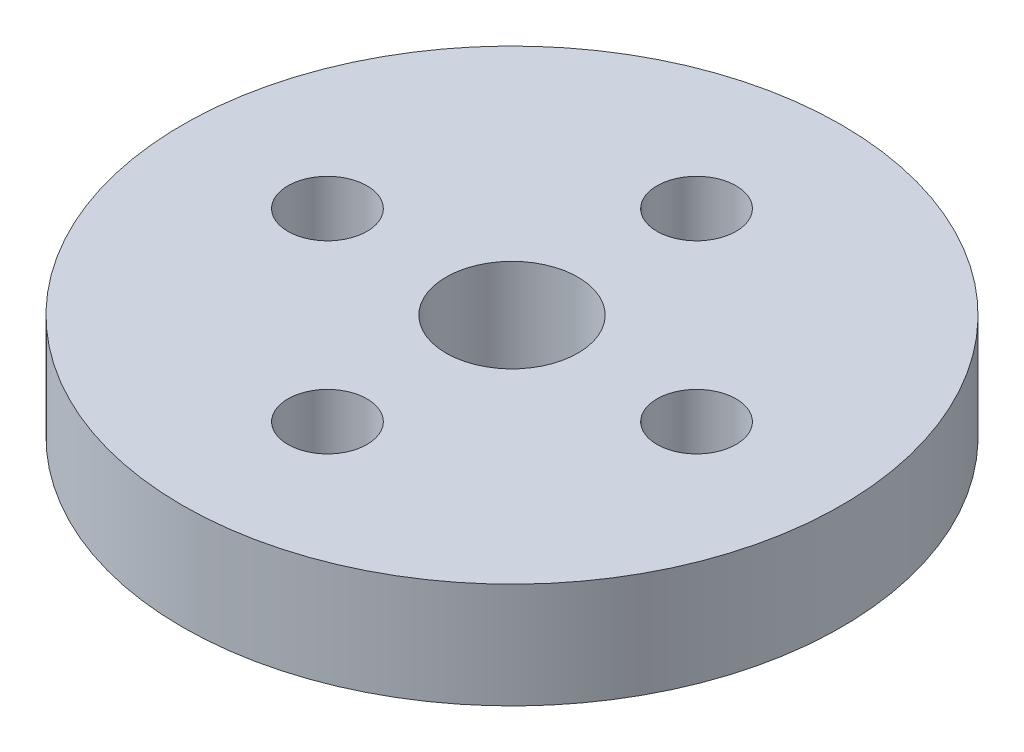
ISO-10303-21;
HEADER;
FILE_DESCRIPTION(('STEP AP214'),'2;1');
FILE_NAME('part.step','',(''),(''),'','','');
FILE_SCHEMA(('AUTOMOTIVE_DESIGN { 1 0 10303 214 1 1 1 1 }'));
ENDSEC;
DATA;
#1=APPLICATION_CONTEXT('core data for automotive mechanical design processes');
#2=APPLICATION_PROTOCOL_DEFINITION('international standard','automotive_design',2000,#1);
#3=PRODUCT_CONTEXT('',#1,'mechanical');
#4=PRODUCT('Part','Part','',(#3));
#5=PRODUCT_RELATED_PRODUCT_CATEGORY('part','',(#4));
#6=PRODUCT_DEFINITION_FORMATION('','',#4);
#7=PRODUCT_DEFINITION_CONTEXT('part definition',#1,'design');
#8=PRODUCT_DEFINITION('design','',#6,#7);
#9=PRODUCT_DEFINITION_SHAPE('','',#8);
#10=(LENGTH_UNIT() NAMED_UNIT(*) SI_UNIT(.MILLI.,.METRE.));
#11=(NAMED_UNIT(*) PLANE_ANGLE_UNIT() SI_UNIT($,.RADIAN.));
#12=(NAMED_UNIT(*) SI_UNIT($,.STERADIAN.) SOLID_ANGLE_UNIT());
#13=UNCERTAINTY_MEASURE_WITH_UNIT(LENGTH_MEASURE(1.E-05),#10,'distance_accuracy_value','');
#14=(GEOMETRIC_REPRESENTATION_CONTEXT(3) GLOBAL_UNCERTAINTY_ASSIGNED_CONTEXT((#13)) GLOBAL_UNIT_ASSIGNED_CONTEXT((#10,
#11,#12)) REPRESENTATION_CONTEXT('',''));
#15=CARTESIAN_POINT('',(0.,0.,0.));
#16=DIRECTION('',(0.,0.,1.));
#17=DIRECTION('',(1.,0.,0.));
#18=AXIS2_PLACEMENT_3D('',#15,#16,#17);
#19=CARTESIAN_POINT('',(0.,4.,0.));
#20=DIRECTION('',(0.,1.,0.));
#21=DIRECTION('',(0.,0.,1.));
#22=AXIS2_PLACEMENT_3D('',#19,#20,#21);
#23=PLANE('',#22);
#24=CARTESIAN_POINT('',(-7.,4.,0.));
#25=DIRECTION('',(0.,1.,0.));
#26=DIRECTION('',(0.,0.,1.));
#27=AXIS2_PLACEMENT_3D('',#24,#25,#26);
#28=CIRCLE('',#27,1.5);
#29=CARTESIAN_POINT('',(-7.,4.,1.5));
#30=VERTEX_POINT('',#29);
#31=EDGE_CURVE('E67',#30,#30,#28,.T.);
#32=ORIENTED_EDGE('',*,*,#31,.F.);
#33=EDGE_LOOP('',(#32));
#34=FACE_BOUND('',#33,.T.);
#35=CARTESIAN_POINT('',(7.,4.,0.));
#36=DIRECTION('',(0.,1.,0.));
#37=DIRECTION('',(0.,0.,1.));
#38=AXIS2_PLACEMENT_3D('',#35,#36,#37);
#39=CIRCLE('',#38,1.5);
#40=CARTESIAN_POINT('',(7.,4.,1.5));
#41=VERTEX_POINT('',#40);
#42=EDGE_CURVE('E55',#41,#41,#39,.T.);
#43=ORIENTED_EDGE('',*,*,#42,.F.);
#44=EDGE_LOOP('',(#43));
#45=FACE_BOUND('',#44,.T.);
#46=CARTESIAN_POINT('',(0.,4.,0.));
#47=DIRECTION('',(0.,1.,0.));
#48=DIRECTION('',(0.,0.,1.));
#49=AXIS2_PLACEMENT_3D('',#46,#47,#48);
#50=CIRCLE('',#49,12.5);
#51=CARTESIAN_POINT('',(0.,4.,12.5));
#52=VERTEX_POINT('',#51);
#53=EDGE_CURVE('E10',#52,#52,#50,.T.);
#54=ORIENTED_EDGE('',*,*,#53,.T.);
#55=EDGE_LOOP('',(#54));
#56=FACE_BOUND('',#55,.T.);
#57=CARTESIAN_POINT('',(0.,4.,-7.));
#58=DIRECTION('',(0.,1.,0.));
#59=DIRECTION('',(0.,0.,1.));
#60=AXIS2_PLACEMENT_3D('',#57,#58,#59);
#61=CIRCLE('',#60,1.5);
#62=CARTESIAN_POINT('',(0.,4.,-5.5));
#63=VERTEX_POINT('',#62);
#64=EDGE_CURVE('E50',#63,#63,#61,.T.);
#65=ORIENTED_EDGE('',*,*,#64,.F.);
#66=EDGE_LOOP('',(#65));
#67=FACE_BOUND('',#66,.T.);
#68=CARTESIAN_POINT('',(0.,4.,7.));
#69=DIRECTION('',(0.,1.,0.));
#70=DIRECTION('',(0.,0.,1.));
#71=AXIS2_PLACEMENT_3D('',#68,#69,#70);
#72=CIRCLE('',#71,1.5);
#73=CARTESIAN_POINT('',(0.,4.,8.5));
#74=VERTEX_POINT('',#73);
#75=EDGE_CURVE('E61',#74,#74,#72,.T.);
#76=ORIENTED_EDGE('',*,*,#75,.F.);
#77=EDGE_LOOP('',(#76));
#78=FACE_BOUND('',#77,.T.);
#79=CARTESIAN_POINT('',(0.,4.,0.));
#80=DIRECTION('',(0.,1.,0.));
#81=DIRECTION('',(0.,0.,1.));
#82=AXIS2_PLACEMENT_3D('',#79,#80,#81);
#83=CIRCLE('',#82,2.5);
#84=CARTESIAN_POINT('',(0.,4.,2.5));
#85=VERTEX_POINT('',#84);
#86=EDGE_CURVE('E73',#85,#85,#83,.T.);
#87=ORIENTED_EDGE('',*,*,#86,.F.);
#88=EDGE_LOOP('',(#87));
#89=FACE_BOUND('',#88,.T.);
#90=ADVANCED_FACE('F39',(#34,#45,#56,#67,#78,#89),#23,.T.);
#91=CARTESIAN_POINT('',(0.,0.,0.));
#92=DIRECTION('',(0.,1.,0.));
#93=DIRECTION('',(0.,0.,1.));
#94=AXIS2_PLACEMENT_3D('',#91,#92,#93);
#95=PLANE('',#94);
#96=CARTESIAN_POINT('',(0.,0.,0.));
#97=DIRECTION('',(0.,1.,0.));
#98=DIRECTION('',(0.,0.,1.));
#99=AXIS2_PLACEMENT_3D('',#96,#97,#98);
#100=CIRCLE('',#99,12.5);
#101=CARTESIAN_POINT('',(0.,0.,12.5));
#102=VERTEX_POINT('',#101);
#103=EDGE_CURVE('E43',#102,#102,#100,.T.);
#104=ORIENTED_EDGE('',*,*,#103,.F.);
#105=EDGE_LOOP('',(#104));
#106=FACE_BOUND('',#105,.T.);
#107=CARTESIAN_POINT('',(0.,0.,-7.));
#108=DIRECTION('',(0.,1.,0.));
#109=DIRECTION('',(0.,0.,1.));
#110=AXIS2_PLACEMENT_3D('',#107,#108,#109);
#111=CIRCLE('',#110,1.5);
#112=CARTESIAN_POINT('',(0.,0.,-5.5));
#113=VERTEX_POINT('',#112);
#114=EDGE_CURVE('E52',#113,#113,#111,.T.);
#115=ORIENTED_EDGE('',*,*,#114,.T.);
#116=EDGE_LOOP('',(#115));
#117=FACE_BOUND('',#116,.T.);
#118=CARTESIAN_POINT('',(7.,0.,0.));
#119=DIRECTION('',(0.,1.,0.));
#120=DIRECTION('',(0.,0.,1.));
#121=AXIS2_PLACEMENT_3D('',#118,#119,#120);
#122=CIRCLE('',#121,1.5);
#123=CARTESIAN_POINT('',(7.,0.,1.5));
#124=VERTEX_POINT('',#123);
#125=EDGE_CURVE('E58',#124,#124,#122,.T.);
#126=ORIENTED_EDGE('',*,*,#125,.T.);
#127=EDGE_LOOP('',(#126));
#128=FACE_BOUND('',#127,.T.);
#129=CARTESIAN_POINT('',(0.,0.,7.));
#130=DIRECTION('',(0.,1.,0.));
#131=DIRECTION('',(0.,0.,1.));
#132=AXIS2_PLACEMENT_3D('',#129,#130,#131);
#133=CIRCLE('',#132,1.5);
#134=CARTESIAN_POINT('',(0.,0.,8.5));
#135=VERTEX_POINT('',#134);
#136=EDGE_CURVE('E64',#135,#135,#133,.T.);
#137=ORIENTED_EDGE('',*,*,#136,.T.);
#138=EDGE_LOOP('',(#137));
#139=FACE_BOUND('',#138,.T.);
#140=CARTESIAN_POINT('',(-7.,0.,0.));
#141=DIRECTION('',(0.,1.,0.));
#142=DIRECTION('',(0.,0.,1.));
#143=AXIS2_PLACEMENT_3D('',#140,#141,#142);
#144=CIRCLE('',#143,1.5);
#145=CARTESIAN_POINT('',(-7.,0.,1.5));
#146=VERTEX_POINT('',#145);
#147=EDGE_CURVE('E70',#146,#146,#144,.T.);
#148=ORIENTED_EDGE('',*,*,#147,.T.);
#149=EDGE_LOOP('',(#148));
#150=FACE_BOUND('',#149,.T.);
#151=CARTESIAN_POINT('',(0.,0.,0.));
#152=DIRECTION('',(0.,1.,0.));
#153=DIRECTION('',(0.,0.,1.));
#154=AXIS2_PLACEMENT_3D('',#151,#152,#153);
#155=CIRCLE('',#154,2.5);
#156=CARTESIAN_POINT('',(0.,0.,2.5));
#157=VERTEX_POINT('',#156);
#158=EDGE_CURVE('E76',#157,#157,#155,.T.);
#159=ORIENTED_EDGE('',*,*,#158,.T.);
#160=EDGE_LOOP('',(#159));
#161=FACE_BOUND('',#160,.T.);
#162=ADVANCED_FACE('F86',(#106,#117,#128,#139,#150,#161),#95,.F.);
#163=CARTESIAN_POINT('',(0.,4.,0.));
#164=DIRECTION('',(0.,-1.,0.));
#165=DIRECTION('',(0.,0.,-1.));
#166=AXIS2_PLACEMENT_3D('',#163,#164,#165);
#167=CYLINDRICAL_SURFACE('',#166,12.5);
#168=ORIENTED_EDGE('',*,*,#53,.F.);
#169=EDGE_LOOP('',(#168));
#170=FACE_BOUND('',#169,.T.);
#171=ORIENTED_EDGE('',*,*,#103,.T.);
#172=EDGE_LOOP('',(#171));
#173=FACE_BOUND('',#172,.T.);
#174=ADVANCED_FACE('F41',(#170,#173),#167,.T.);
#175=CARTESIAN_POINT('',(0.,4.,-7.));
#176=DIRECTION('',(0.,-1.,0.));
#177=DIRECTION('',(0.,0.,-1.));
#178=AXIS2_PLACEMENT_3D('',#175,#176,#177);
#179=CYLINDRICAL_SURFACE('',#178,1.5);
#180=ORIENTED_EDGE('',*,*,#64,.T.);
#181=EDGE_LOOP('',(#180));
#182=FACE_BOUND('',#181,.T.);
#183=ORIENTED_EDGE('',*,*,#114,.F.);
#184=EDGE_LOOP('',(#183));
#185=FACE_BOUND('',#184,.T.);
#186=ADVANCED_FACE('F96',(#182,#185),#179,.F.);
#187=CARTESIAN_POINT('',(7.,4.,0.));
#188=DIRECTION('',(0.,-1.,0.));
#189=DIRECTION('',(0.,0.,-1.));
#190=AXIS2_PLACEMENT_3D('',#187,#188,#189);
#191=CYLINDRICAL_SURFACE('',#190,1.5);
#192=ORIENTED_EDGE('',*,*,#42,.T.);
#193=EDGE_LOOP('',(#192));
#194=FACE_BOUND('',#193,.T.);
#195=ORIENTED_EDGE('',*,*,#125,.F.);
#196=EDGE_LOOP('',(#195));
#197=FACE_BOUND('',#196,.T.);
#198=ADVANCED_FACE('F99',(#194,#197),#191,.F.);
#199=CARTESIAN_POINT('',(0.,4.,7.));
#200=DIRECTION('',(0.,-1.,0.));
#201=DIRECTION('',(0.,0.,-1.));
#202=AXIS2_PLACEMENT_3D('',#199,#200,#201);
#203=CYLINDRICAL_SURFACE('',#202,1.5);
#204=ORIENTED_EDGE('',*,*,#75,.T.);
#205=EDGE_LOOP('',(#204));
#206=FACE_BOUND('',#205,.T.);
#207=ORIENTED_EDGE('',*,*,#136,.F.);
#208=EDGE_LOOP('',(#207));
#209=FACE_BOUND('',#208,.T.);
#210=ADVANCED_FACE('F103',(#206,#209),#203,.F.);
#211=CARTESIAN_POINT('',(-7.,4.,0.));
#212=DIRECTION('',(0.,-1.,0.));
#213=DIRECTION('',(0.,0.,-1.));
#214=AXIS2_PLACEMENT_3D('',#211,#212,#213);
#215=CYLINDRICAL_SURFACE('',#214,1.5);
#216=ORIENTED_EDGE('',*,*,#31,.T.);
#217=EDGE_LOOP('',(#216));
#218=FACE_BOUND('',#217,.T.);
#219=ORIENTED_EDGE('',*,*,#147,.F.);
#220=EDGE_LOOP('',(#219));
#221=FACE_BOUND('',#220,.T.);
#222=ADVANCED_FACE('F107',(#218,#221),#215,.F.);
#223=CARTESIAN_POINT('',(0.,4.,0.));
#224=DIRECTION('',(0.,-1.,0.));
#225=DIRECTION('',(0.,0.,-1.));
#226=AXIS2_PLACEMENT_3D('',#223,#224,#225);
#227=CYLINDRICAL_SURFACE('',#226,2.5);
#228=ORIENTED_EDGE('',*,*,#86,.T.);
#229=EDGE_LOOP('',(#228));
#230=FACE_BOUND('',#229,.T.);
#231=ORIENTED_EDGE('',*,*,#158,.F.);
#232=EDGE_LOOP('',(#231));
#233=FACE_BOUND('',#232,.T.);
#234=ADVANCED_FACE('F82',(#230,#233),#227,.F.);
#235=CLOSED_SHELL('',(#90,#162,#174,#186,#198,#210,#222,#234));
#236=MANIFOLD_SOLID_BREP('B2',#235);
#237=ADVANCED_BREP_SHAPE_REPRESENTATION('',(#18,#236),#14);
#238=SHAPE_DEFINITION_REPRESENTATION(#9,#237);
ENDSEC;
END-ISO-10303-21;
